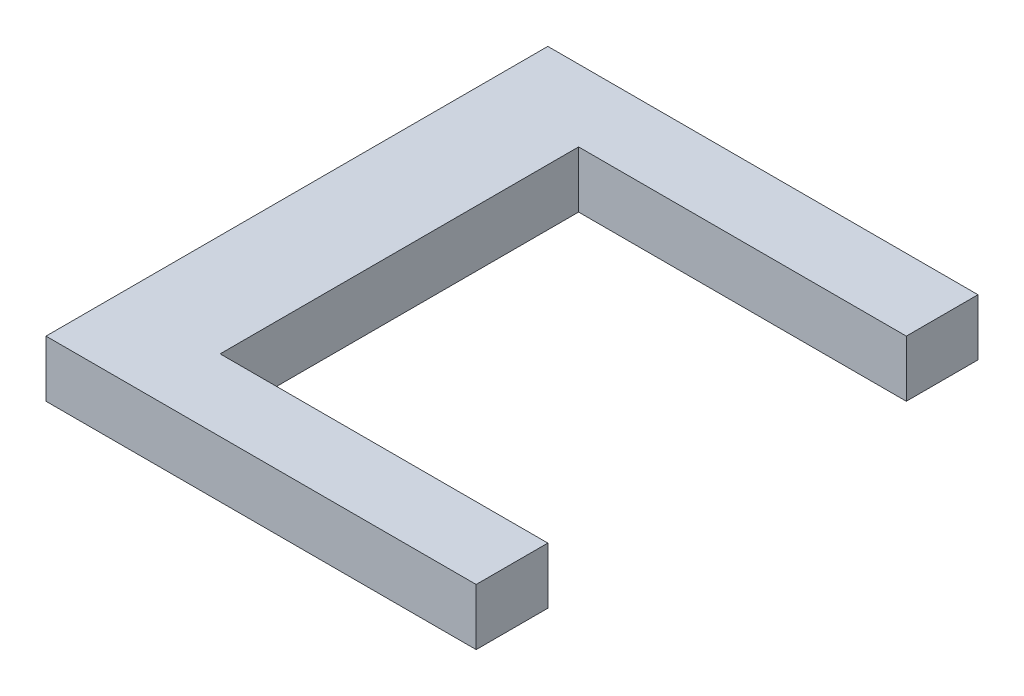
ISO-10303-21;
HEADER;
FILE_DESCRIPTION(('STEP AP214'),'2;1');
FILE_NAME('part.step','',(''),(''),'','','');
FILE_SCHEMA(('AUTOMOTIVE_DESIGN { 1 0 10303 214 1 1 1 1 }'));
ENDSEC;
DATA;
#1=APPLICATION_CONTEXT('core data for automotive mechanical design processes');
#2=APPLICATION_PROTOCOL_DEFINITION('international standard','automotive_design',2000,#1);
#3=PRODUCT_CONTEXT('',#1,'mechanical');
#4=PRODUCT('Part','Part','',(#3));
#5=PRODUCT_RELATED_PRODUCT_CATEGORY('part','',(#4));
#6=PRODUCT_DEFINITION_FORMATION('','',#4);
#7=PRODUCT_DEFINITION_CONTEXT('part definition',#1,'design');
#8=PRODUCT_DEFINITION('design','',#6,#7);
#9=PRODUCT_DEFINITION_SHAPE('','',#8);
#10=(LENGTH_UNIT() NAMED_UNIT(*) SI_UNIT(.MILLI.,.METRE.));
#11=(NAMED_UNIT(*) PLANE_ANGLE_UNIT() SI_UNIT($,.RADIAN.));
#12=(NAMED_UNIT(*) SI_UNIT($,.STERADIAN.) SOLID_ANGLE_UNIT());
#13=UNCERTAINTY_MEASURE_WITH_UNIT(LENGTH_MEASURE(1.E-05),#10,'distance_accuracy_value','');
#14=(GEOMETRIC_REPRESENTATION_CONTEXT(3) GLOBAL_UNCERTAINTY_ASSIGNED_CONTEXT((#13)) GLOBAL_UNIT_ASSIGNED_CONTEXT((#10,
#11,#12)) REPRESENTATION_CONTEXT('',''));
#15=CARTESIAN_POINT('',(0.,0.,0.));
#16=DIRECTION('',(0.,0.,1.));
#17=DIRECTION('',(1.,0.,0.));
#18=AXIS2_PLACEMENT_3D('',#15,#16,#17);
#19=CARTESIAN_POINT('',(0.,10.,-12.7));
#20=DIRECTION('',(0.,0.,-1.));
#21=DIRECTION('',(-1.,0.,0.));
#22=AXIS2_PLACEMENT_3D('',#19,#20,#21);
#23=PLANE('',#22);
#24=DIRECTION('',(1.,0.,0.));
#25=VECTOR('',#24,1.);
#26=CARTESIAN_POINT('',(0.,0.,-12.7));
#27=LINE('',#26,#25);
#28=CARTESIAN_POINT('',(18.1474874687986,0.,-12.7));
#29=VERTEX_POINT('',#28);
#30=CARTESIAN_POINT('',(76.2,0.,-12.7));
#31=VERTEX_POINT('',#30);
#32=EDGE_CURVE('E127',#29,#31,#27,.T.);
#33=ORIENTED_EDGE('',*,*,#32,.F.);
#34=DIRECTION('',(0.,-1.,0.));
#35=VECTOR('',#34,1.);
#36=CARTESIAN_POINT('',(18.1474874687986,10.,-12.7));
#37=LINE('',#36,#35);
#38=CARTESIAN_POINT('',(18.1474874687986,10.,-12.7));
#39=VERTEX_POINT('',#38);
#40=EDGE_CURVE('E11',#39,#29,#37,.T.);
#41=ORIENTED_EDGE('',*,*,#40,.F.);
#42=DIRECTION('',(1.,0.,0.));
#43=VECTOR('',#42,1.);
#44=CARTESIAN_POINT('',(0.,10.,-12.7));
#45=LINE('',#44,#43);
#46=CARTESIAN_POINT('',(76.2,10.,-12.7));
#47=VERTEX_POINT('',#46);
#48=EDGE_CURVE('E172',#39,#47,#45,.T.);
#49=ORIENTED_EDGE('',*,*,#48,.T.);
#50=DIRECTION('',(0.,-1.,0.));
#51=VECTOR('',#50,1.);
#52=CARTESIAN_POINT('',(76.2,10.,-12.7));
#53=LINE('',#52,#51);
#54=EDGE_CURVE('E85',#47,#31,#53,.T.);
#55=ORIENTED_EDGE('',*,*,#54,.T.);
#56=EDGE_LOOP('',(#33,#41,#49,#55));
#57=FACE_BOUND('',#56,.T.);
#58=ADVANCED_FACE('F35',(#57),#23,.T.);
#59=CARTESIAN_POINT('',(18.1474874687986,10.,0.));
#60=DIRECTION('',(1.,0.,0.));
#61=DIRECTION('',(0.,0.,-1.));
#62=AXIS2_PLACEMENT_3D('',#59,#60,#61);
#63=PLANE('',#62);
#64=DIRECTION('',(0.,0.,1.));
#65=VECTOR('',#64,1.);
#66=CARTESIAN_POINT('',(18.1474874687986,0.,0.));
#67=LINE('',#66,#65);
#68=CARTESIAN_POINT('',(18.1474874687986,0.,-76.2));
#69=VERTEX_POINT('',#68);
#70=EDGE_CURVE('E130',#69,#29,#67,.T.);
#71=ORIENTED_EDGE('',*,*,#70,.F.);
#72=DIRECTION('',(0.,-1.,0.));
#73=VECTOR('',#72,1.);
#74=CARTESIAN_POINT('',(18.1474874687986,10.,-76.2));
#75=LINE('',#74,#73);
#76=CARTESIAN_POINT('',(18.1474874687986,10.,-76.2));
#77=VERTEX_POINT('',#76);
#78=EDGE_CURVE('E43',#77,#69,#75,.T.);
#79=ORIENTED_EDGE('',*,*,#78,.F.);
#80=DIRECTION('',(0.,0.,1.));
#81=VECTOR('',#80,1.);
#82=CARTESIAN_POINT('',(18.1474874687986,10.,0.));
#83=LINE('',#82,#81);
#84=EDGE_CURVE('E170',#77,#39,#83,.T.);
#85=ORIENTED_EDGE('',*,*,#84,.T.);
#86=ORIENTED_EDGE('',*,*,#40,.T.);
#87=EDGE_LOOP('',(#71,#79,#85,#86));
#88=FACE_BOUND('',#87,.T.);
#89=ADVANCED_FACE('F161',(#88),#63,.T.);
#90=CARTESIAN_POINT('',(0.,10.,-76.2));
#91=DIRECTION('',(0.,0.,1.));
#92=DIRECTION('',(1.,0.,0.));
#93=AXIS2_PLACEMENT_3D('',#90,#91,#92);
#94=PLANE('',#93);
#95=DIRECTION('',(-1.,0.,0.));
#96=VECTOR('',#95,1.);
#97=CARTESIAN_POINT('',(0.,0.,-76.2));
#98=LINE('',#97,#96);
#99=CARTESIAN_POINT('',(76.2,0.,-76.2));
#100=VERTEX_POINT('',#99);
#101=EDGE_CURVE('E133',#100,#69,#98,.T.);
#102=ORIENTED_EDGE('',*,*,#101,.F.);
#103=DIRECTION('',(0.,-1.,0.));
#104=VECTOR('',#103,1.);
#105=CARTESIAN_POINT('',(76.2,10.,-76.2));
#106=LINE('',#105,#104);
#107=CARTESIAN_POINT('',(76.2,10.,-76.2));
#108=VERTEX_POINT('',#107);
#109=EDGE_CURVE('E150',#108,#100,#106,.T.);
#110=ORIENTED_EDGE('',*,*,#109,.F.);
#111=DIRECTION('',(-1.,0.,0.));
#112=VECTOR('',#111,1.);
#113=CARTESIAN_POINT('',(0.,10.,-76.2));
#114=LINE('',#113,#112);
#115=EDGE_CURVE('E157',#108,#77,#114,.T.);
#116=ORIENTED_EDGE('',*,*,#115,.T.);
#117=ORIENTED_EDGE('',*,*,#78,.T.);
#118=EDGE_LOOP('',(#102,#110,#116,#117));
#119=FACE_BOUND('',#118,.T.);
#120=ADVANCED_FACE('F155',(#119),#94,.T.);
#121=CARTESIAN_POINT('',(76.2,10.,0.));
#122=DIRECTION('',(-1.,0.,0.));
#123=DIRECTION('',(0.,0.,1.));
#124=AXIS2_PLACEMENT_3D('',#121,#122,#123);
#125=PLANE('',#124);
#126=DIRECTION('',(0.,0.,-1.));
#127=VECTOR('',#126,1.);
#128=CARTESIAN_POINT('',(76.2,0.,0.));
#129=LINE('',#128,#127);
#130=CARTESIAN_POINT('',(76.2,0.,-88.9));
#131=VERTEX_POINT('',#130);
#132=EDGE_CURVE('E136',#100,#131,#129,.T.);
#133=ORIENTED_EDGE('',*,*,#132,.T.);
#134=DIRECTION('',(0.,-1.,0.));
#135=VECTOR('',#134,1.);
#136=CARTESIAN_POINT('',(76.2,10.,-88.9));
#137=LINE('',#136,#135);
#138=CARTESIAN_POINT('',(76.2,10.,-88.9));
#139=VERTEX_POINT('',#138);
#140=EDGE_CURVE('E148',#139,#131,#137,.T.);
#141=ORIENTED_EDGE('',*,*,#140,.F.);
#142=DIRECTION('',(0.,0.,-1.));
#143=VECTOR('',#142,1.);
#144=CARTESIAN_POINT('',(76.2,10.,0.));
#145=LINE('',#144,#143);
#146=EDGE_CURVE('E123',#108,#139,#145,.T.);
#147=ORIENTED_EDGE('',*,*,#146,.F.);
#148=ORIENTED_EDGE('',*,*,#109,.T.);
#149=EDGE_LOOP('',(#133,#141,#147,#148));
#150=FACE_BOUND('',#149,.T.);
#151=ADVANCED_FACE('F168',(#150),#125,.F.);
#152=CARTESIAN_POINT('',(0.,10.,-88.9));
#153=DIRECTION('',(0.,0.,-1.));
#154=DIRECTION('',(-1.,0.,0.));
#155=AXIS2_PLACEMENT_3D('',#152,#153,#154);
#156=PLANE('',#155);
#157=DIRECTION('',(1.,0.,0.));
#158=VECTOR('',#157,1.);
#159=CARTESIAN_POINT('',(0.,0.,-88.9));
#160=LINE('',#159,#158);
#161=CARTESIAN_POINT('',(0.,0.,-88.9));
#162=VERTEX_POINT('',#161);
#163=EDGE_CURVE('E139',#162,#131,#160,.T.);
#164=ORIENTED_EDGE('',*,*,#163,.F.);
#165=DIRECTION('',(0.,-1.,0.));
#166=VECTOR('',#165,1.);
#167=CARTESIAN_POINT('',(0.,10.,-88.9));
#168=LINE('',#167,#166);
#169=CARTESIAN_POINT('',(0.,10.,-88.9));
#170=VERTEX_POINT('',#169);
#171=EDGE_CURVE('E112',#170,#162,#168,.T.);
#172=ORIENTED_EDGE('',*,*,#171,.F.);
#173=DIRECTION('',(1.,0.,0.));
#174=VECTOR('',#173,1.);
#175=CARTESIAN_POINT('',(0.,10.,-88.9));
#176=LINE('',#175,#174);
#177=EDGE_CURVE('E121',#170,#139,#176,.T.);
#178=ORIENTED_EDGE('',*,*,#177,.T.);
#179=ORIENTED_EDGE('',*,*,#140,.T.);
#180=EDGE_LOOP('',(#164,#172,#178,#179));
#181=FACE_BOUND('',#180,.T.);
#182=ADVANCED_FACE('F187',(#181),#156,.T.);
#183=CARTESIAN_POINT('',(0.,10.,0.));
#184=DIRECTION('',(-1.,0.,0.));
#185=DIRECTION('',(0.,0.,1.));
#186=AXIS2_PLACEMENT_3D('',#183,#184,#185);
#187=PLANE('',#186);
#188=DIRECTION('',(0.,0.,-1.));
#189=VECTOR('',#188,1.);
#190=CARTESIAN_POINT('',(0.,0.,0.));
#191=LINE('',#190,#189);
#192=CARTESIAN_POINT('',(0.,0.,0.));
#193=VERTEX_POINT('',#192);
#194=EDGE_CURVE('E111',#193,#162,#191,.T.);
#195=ORIENTED_EDGE('',*,*,#194,.F.);
#196=DIRECTION('',(0.,-1.,0.));
#197=VECTOR('',#196,1.);
#198=CARTESIAN_POINT('',(0.,10.,0.));
#199=LINE('',#198,#197);
#200=CARTESIAN_POINT('',(0.,10.,0.));
#201=VERTEX_POINT('',#200);
#202=EDGE_CURVE('E105',#201,#193,#199,.T.);
#203=ORIENTED_EDGE('',*,*,#202,.F.);
#204=DIRECTION('',(0.,0.,-1.));
#205=VECTOR('',#204,1.);
#206=CARTESIAN_POINT('',(0.,10.,0.));
#207=LINE('',#206,#205);
#208=EDGE_CURVE('E109',#201,#170,#207,.T.);
#209=ORIENTED_EDGE('',*,*,#208,.T.);
#210=ORIENTED_EDGE('',*,*,#171,.T.);
#211=EDGE_LOOP('',(#195,#203,#209,#210));
#212=FACE_BOUND('',#211,.T.);
#213=ADVANCED_FACE('F107',(#212),#187,.T.);
#214=CARTESIAN_POINT('',(0.,10.,0.));
#215=DIRECTION('',(0.,0.,-1.));
#216=DIRECTION('',(-1.,0.,0.));
#217=AXIS2_PLACEMENT_3D('',#214,#215,#216);
#218=PLANE('',#217);
#219=DIRECTION('',(1.,0.,0.));
#220=VECTOR('',#219,1.);
#221=CARTESIAN_POINT('',(0.,0.,0.));
#222=LINE('',#221,#220);
#223=CARTESIAN_POINT('',(76.2,0.,0.));
#224=VERTEX_POINT('',#223);
#225=EDGE_CURVE('E78',#193,#224,#222,.T.);
#226=ORIENTED_EDGE('',*,*,#225,.T.);
#227=DIRECTION('',(0.,-1.,0.));
#228=VECTOR('',#227,1.);
#229=CARTESIAN_POINT('',(76.2,10.,0.));
#230=LINE('',#229,#228);
#231=CARTESIAN_POINT('',(76.2,10.,0.));
#232=VERTEX_POINT('',#231);
#233=EDGE_CURVE('E113',#232,#224,#230,.T.);
#234=ORIENTED_EDGE('',*,*,#233,.F.);
#235=DIRECTION('',(1.,0.,0.));
#236=VECTOR('',#235,1.);
#237=CARTESIAN_POINT('',(0.,10.,0.));
#238=LINE('',#237,#236);
#239=EDGE_CURVE('E115',#201,#232,#238,.T.);
#240=ORIENTED_EDGE('',*,*,#239,.F.);
#241=ORIENTED_EDGE('',*,*,#202,.T.);
#242=EDGE_LOOP('',(#226,#234,#240,#241));
#243=FACE_BOUND('',#242,.T.);
#244=ADVANCED_FACE('F116',(#243),#218,.F.);
#245=EDGE_CURVE('E140',#224,#31,#129,.T.);
#246=ORIENTED_EDGE('',*,*,#245,.T.);
#247=ORIENTED_EDGE('',*,*,#54,.F.);
#248=EDGE_CURVE('E51',#232,#47,#145,.T.);
#249=ORIENTED_EDGE('',*,*,#248,.F.);
#250=ORIENTED_EDGE('',*,*,#233,.T.);
#251=EDGE_LOOP('',(#246,#247,#249,#250));
#252=FACE_BOUND('',#251,.T.);
#253=ADVANCED_FACE('F177',(#252),#125,.F.);
#254=CARTESIAN_POINT('',(0.,10.,0.));
#255=DIRECTION('',(0.,1.,0.));
#256=DIRECTION('',(0.,0.,1.));
#257=AXIS2_PLACEMENT_3D('',#254,#255,#256);
#258=PLANE('',#257);
#259=ORIENTED_EDGE('',*,*,#48,.F.);
#260=ORIENTED_EDGE('',*,*,#84,.F.);
#261=ORIENTED_EDGE('',*,*,#115,.F.);
#262=ORIENTED_EDGE('',*,*,#146,.T.);
#263=ORIENTED_EDGE('',*,*,#177,.F.);
#264=ORIENTED_EDGE('',*,*,#208,.F.);
#265=ORIENTED_EDGE('',*,*,#239,.T.);
#266=ORIENTED_EDGE('',*,*,#248,.T.);
#267=EDGE_LOOP('',(#259,#260,#261,#262,#263,#264,#265,#266));
#268=FACE_BOUND('',#267,.T.);
#269=ADVANCED_FACE('F119',(#268),#258,.T.);
#270=CARTESIAN_POINT('',(0.,0.,0.));
#271=DIRECTION('',(0.,1.,0.));
#272=DIRECTION('',(0.,0.,1.));
#273=AXIS2_PLACEMENT_3D('',#270,#271,#272);
#274=PLANE('',#273);
#275=ORIENTED_EDGE('',*,*,#32,.T.);
#276=ORIENTED_EDGE('',*,*,#245,.F.);
#277=ORIENTED_EDGE('',*,*,#225,.F.);
#278=ORIENTED_EDGE('',*,*,#194,.T.);
#279=ORIENTED_EDGE('',*,*,#163,.T.);
#280=ORIENTED_EDGE('',*,*,#132,.F.);
#281=ORIENTED_EDGE('',*,*,#101,.T.);
#282=ORIENTED_EDGE('',*,*,#70,.T.);
#283=EDGE_LOOP('',(#275,#276,#277,#278,#279,#280,#281,#282));
#284=FACE_BOUND('',#283,.T.);
#285=ADVANCED_FACE('F164',(#284),#274,.F.);
#286=CLOSED_SHELL('',(#58,#89,#120,#151,#182,#213,#244,#253,#269,#285));
#287=MANIFOLD_SOLID_BREP('B2',#286);
#288=ADVANCED_BREP_SHAPE_REPRESENTATION('',(#18,#287),#14);
#289=SHAPE_DEFINITION_REPRESENTATION(#9,#288);
ENDSEC;
END-ISO-10303-21;
